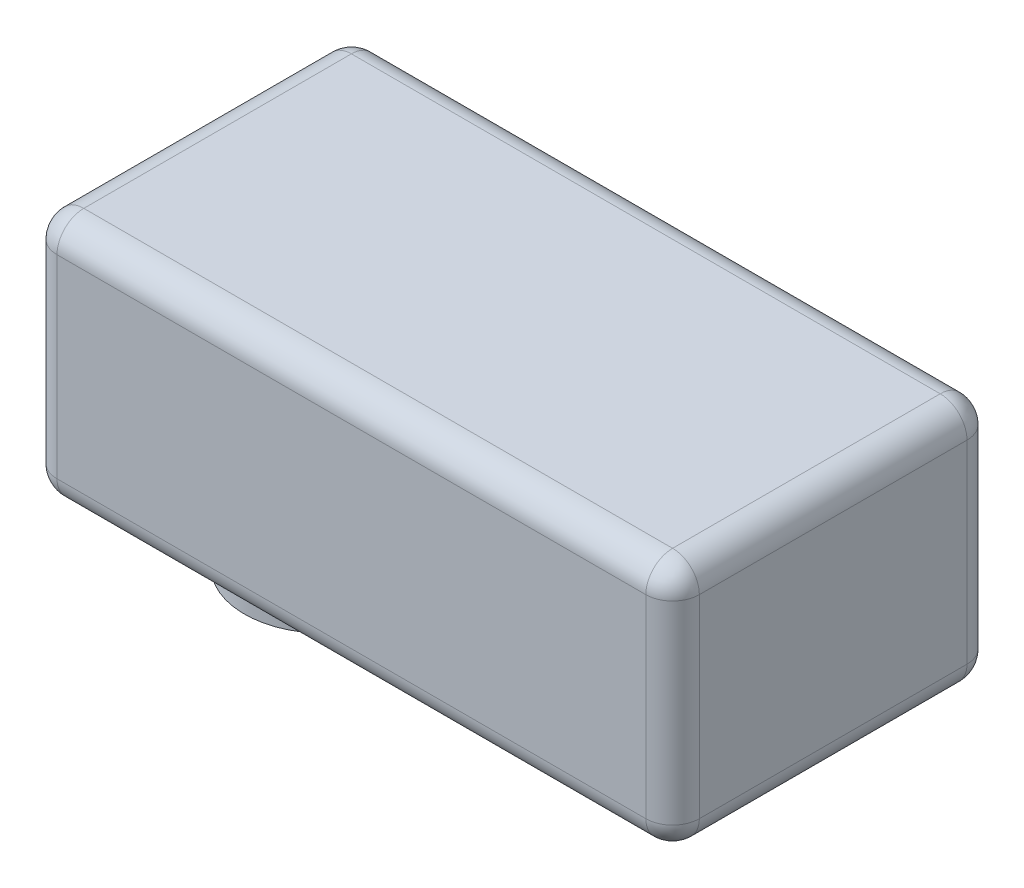
ISO-10303-21;
HEADER;
FILE_DESCRIPTION(('STEP AP214'),'2;1');
FILE_NAME('part.step','',(''),(''),'','','');
FILE_SCHEMA(('AUTOMOTIVE_DESIGN { 1 0 10303 214 1 1 1 1 }'));
ENDSEC;
DATA;
#1=APPLICATION_CONTEXT('core data for automotive mechanical design processes');
#2=APPLICATION_PROTOCOL_DEFINITION('international standard','automotive_design',2000,#1);
#3=PRODUCT_CONTEXT('',#1,'mechanical');
#4=PRODUCT('Part','Part','',(#3));
#5=PRODUCT_RELATED_PRODUCT_CATEGORY('part','',(#4));
#6=PRODUCT_DEFINITION_FORMATION('','',#4);
#7=PRODUCT_DEFINITION_CONTEXT('part definition',#1,'design');
#8=PRODUCT_DEFINITION('design','',#6,#7);
#9=PRODUCT_DEFINITION_SHAPE('','',#8);
#10=(LENGTH_UNIT() NAMED_UNIT(*) SI_UNIT(.MILLI.,.METRE.));
#11=(NAMED_UNIT(*) PLANE_ANGLE_UNIT() SI_UNIT($,.RADIAN.));
#12=(NAMED_UNIT(*) SI_UNIT($,.STERADIAN.) SOLID_ANGLE_UNIT());
#13=UNCERTAINTY_MEASURE_WITH_UNIT(LENGTH_MEASURE(1.E-05),#10,'distance_accuracy_value','');
#14=(GEOMETRIC_REPRESENTATION_CONTEXT(3) GLOBAL_UNCERTAINTY_ASSIGNED_CONTEXT((#13)) GLOBAL_UNIT_ASSIGNED_CONTEXT((#10,
#11,#12)) REPRESENTATION_CONTEXT('',''));
#15=CARTESIAN_POINT('',(0.,0.,0.));
#16=DIRECTION('',(0.,0.,1.));
#17=DIRECTION('',(1.,0.,0.));
#18=AXIS2_PLACEMENT_3D('',#15,#16,#17);
#19=CARTESIAN_POINT('',(22.,13.25,55.));
#20=DIRECTION('',(0.,-1.,0.));
#21=DIRECTION('',(1.,0.,0.));
#22=AXIS2_PLACEMENT_3D('',#19,#20,#21);
#23=SPHERICAL_SURFACE('',#22,2.);
#24=CARTESIAN_POINT('',(22.,13.25,55.));
#25=DIRECTION('',(0.,0.,-1.));
#26=DIRECTION('',(1.,0.,0.));
#27=AXIS2_PLACEMENT_3D('',#24,#25,#26);
#28=CIRCLE('',#27,2.);
#29=CARTESIAN_POINT('',(22.,15.25,55.));
#30=VERTEX_POINT('',#29);
#31=CARTESIAN_POINT('',(24.,13.25,55.));
#32=VERTEX_POINT('',#31);
#33=EDGE_CURVE('P0_E11',#30,#32,#28,.T.);
#34=ORIENTED_EDGE('',*,*,#33,.F.);
#35=CARTESIAN_POINT('',(22.,13.25,55.));
#36=DIRECTION('',(1.,0.,0.));
#37=DIRECTION('',(0.,0.,1.));
#38=AXIS2_PLACEMENT_3D('',#35,#36,#37);
#39=CIRCLE('',#38,2.);
#40=CARTESIAN_POINT('',(22.,13.25,57.));
#41=VERTEX_POINT('',#40);
#42=EDGE_CURVE('P0_E126',#30,#41,#39,.T.);
#43=ORIENTED_EDGE('',*,*,#42,.T.);
#44=CARTESIAN_POINT('',(22.,13.25,55.));
#45=DIRECTION('',(0.,-1.,0.));
#46=DIRECTION('',(1.,0.,0.));
#47=AXIS2_PLACEMENT_3D('',#44,#45,#46);
#48=CIRCLE('',#47,2.);
#49=EDGE_CURVE('P0_E173',#32,#41,#48,.T.);
#50=ORIENTED_EDGE('',*,*,#49,.F.);
#51=EDGE_LOOP('',(#34,#43,#50));
#52=FACE_BOUND('',#51,.T.);
#53=ADVANCED_FACE('P0_F17',(#52),#23,.T.);
#54=CARTESIAN_POINT('',(22.,13.25,35.));
#55=DIRECTION('',(0.,0.,1.));
#56=DIRECTION('',(1.,0.,0.));
#57=AXIS2_PLACEMENT_3D('',#54,#55,#56);
#58=SPHERICAL_SURFACE('',#57,2.);
#59=CARTESIAN_POINT('',(22.,13.25,35.));
#60=DIRECTION('',(0.,-1.,0.));
#61=DIRECTION('',(1.,0.,0.));
#62=AXIS2_PLACEMENT_3D('',#59,#60,#61);
#63=CIRCLE('',#62,2.);
#64=CARTESIAN_POINT('',(22.,13.25,33.));
#65=VERTEX_POINT('',#64);
#66=CARTESIAN_POINT('',(24.,13.25,35.));
#67=VERTEX_POINT('',#66);
#68=EDGE_CURVE('P0_E122',#65,#67,#63,.T.);
#69=ORIENTED_EDGE('',*,*,#68,.F.);
#70=CARTESIAN_POINT('',(22.,13.25,35.));
#71=DIRECTION('',(1.,0.,0.));
#72=DIRECTION('',(0.,1.,0.));
#73=AXIS2_PLACEMENT_3D('',#70,#71,#72);
#74=CIRCLE('',#73,2.);
#75=CARTESIAN_POINT('',(22.,15.25,35.));
#76=VERTEX_POINT('',#75);
#77=EDGE_CURVE('P0_E137',#65,#76,#74,.T.);
#78=ORIENTED_EDGE('',*,*,#77,.T.);
#79=CARTESIAN_POINT('',(22.,13.25,35.));
#80=DIRECTION('',(0.,0.,1.));
#81=DIRECTION('',(1.,0.,0.));
#82=AXIS2_PLACEMENT_3D('',#79,#80,#81);
#83=CIRCLE('',#82,2.);
#84=EDGE_CURVE('P0_E27',#67,#76,#83,.T.);
#85=ORIENTED_EDGE('',*,*,#84,.F.);
#86=EDGE_LOOP('',(#69,#78,#85));
#87=FACE_BOUND('',#86,.T.);
#88=ADVANCED_FACE('P0_F19',(#87),#58,.T.);
#89=CARTESIAN_POINT('',(24.,-3.25,33.));
#90=DIRECTION('',(1.,0.,0.));
#91=DIRECTION('',(0.,1.,0.));
#92=AXIS2_PLACEMENT_3D('',#89,#90,#91);
#93=PLANE('',#92);
#94=DIRECTION('',(0.,0.,1.));
#95=VECTOR('',#94,1.);
#96=CARTESIAN_POINT('',(24.,-1.25,33.));
#97=LINE('',#96,#95);
#98=CARTESIAN_POINT('',(24.,-1.25,35.));
#99=VERTEX_POINT('',#98);
#100=CARTESIAN_POINT('',(24.,-1.25,55.));
#101=VERTEX_POINT('',#100);
#102=EDGE_CURVE('P0_E141',#99,#101,#97,.T.);
#103=ORIENTED_EDGE('',*,*,#102,.F.);
#104=DIRECTION('',(0.,1.,0.));
#105=VECTOR('',#104,1.);
#106=CARTESIAN_POINT('',(24.,-3.25,35.));
#107=LINE('',#106,#105);
#108=EDGE_CURVE('P0_E116',#99,#67,#107,.T.);
#109=ORIENTED_EDGE('',*,*,#108,.T.);
#110=DIRECTION('',(0.,0.,1.));
#111=VECTOR('',#110,1.);
#112=CARTESIAN_POINT('',(24.,13.25,33.));
#113=LINE('',#112,#111);
#114=EDGE_CURVE('P0_E177',#67,#32,#113,.T.);
#115=ORIENTED_EDGE('',*,*,#114,.T.);
#116=DIRECTION('',(0.,1.,0.));
#117=VECTOR('',#116,1.);
#118=CARTESIAN_POINT('',(24.,-3.25,55.));
#119=LINE('',#118,#117);
#120=EDGE_CURVE('P0_E144',#101,#32,#119,.T.);
#121=ORIENTED_EDGE('',*,*,#120,.F.);
#122=EDGE_LOOP('',(#103,#109,#115,#121));
#123=FACE_BOUND('',#122,.T.);
#124=ADVANCED_FACE('P0_F142',(#123),#93,.T.);
#125=CARTESIAN_POINT('',(22.,-1.25,55.));
#126=DIRECTION('',(0.,0.,-1.));
#127=DIRECTION('',(1.,0.,0.));
#128=AXIS2_PLACEMENT_3D('',#125,#126,#127);
#129=SPHERICAL_SURFACE('',#128,2.);
#130=CARTESIAN_POINT('',(22.,-1.25,55.));
#131=DIRECTION('',(0.,1.,0.));
#132=DIRECTION('',(1.,0.,0.));
#133=AXIS2_PLACEMENT_3D('',#130,#131,#132);
#134=CIRCLE('',#133,2.);
#135=CARTESIAN_POINT('',(22.,-1.25,57.));
#136=VERTEX_POINT('',#135);
#137=EDGE_CURVE('P0_E174',#136,#101,#134,.T.);
#138=ORIENTED_EDGE('',*,*,#137,.F.);
#139=CARTESIAN_POINT('',(22.,-1.25,55.));
#140=DIRECTION('',(1.,0.,0.));
#141=DIRECTION('',(0.,-1.,0.));
#142=AXIS2_PLACEMENT_3D('',#139,#140,#141);
#143=CIRCLE('',#142,2.);
#144=CARTESIAN_POINT('',(22.,-3.25,55.));
#145=VERTEX_POINT('',#144);
#146=EDGE_CURVE('P0_E161',#136,#145,#143,.T.);
#147=ORIENTED_EDGE('',*,*,#146,.T.);
#148=CARTESIAN_POINT('',(22.,-1.25,55.));
#149=DIRECTION('',(0.,0.,-1.));
#150=DIRECTION('',(1.,0.,0.));
#151=AXIS2_PLACEMENT_3D('',#148,#149,#150);
#152=CIRCLE('',#151,2.);
#153=EDGE_CURVE('P0_E155',#101,#145,#152,.T.);
#154=ORIENTED_EDGE('',*,*,#153,.F.);
#155=EDGE_LOOP('',(#138,#147,#154));
#156=FACE_BOUND('',#155,.T.);
#157=ADVANCED_FACE('P0_F225',(#156),#129,.T.);
#158=CARTESIAN_POINT('',(22.,-1.25,35.));
#159=DIRECTION('',(0.,0.,1.));
#160=DIRECTION('',(1.,0.,0.));
#161=AXIS2_PLACEMENT_3D('',#158,#159,#160);
#162=SPHERICAL_SURFACE('',#161,2.);
#163=CARTESIAN_POINT('',(22.,-1.25,35.));
#164=DIRECTION('',(0.,0.,-1.));
#165=DIRECTION('',(1.,0.,0.));
#166=AXIS2_PLACEMENT_3D('',#163,#164,#165);
#167=CIRCLE('',#166,2.);
#168=CARTESIAN_POINT('',(22.,-3.25,35.));
#169=VERTEX_POINT('',#168);
#170=EDGE_CURVE('P0_E132',#99,#169,#167,.T.);
#171=ORIENTED_EDGE('',*,*,#170,.T.);
#172=CARTESIAN_POINT('',(22.,-1.25,35.));
#173=DIRECTION('',(-1.,0.,0.));
#174=DIRECTION('',(0.,-1.,0.));
#175=AXIS2_PLACEMENT_3D('',#172,#173,#174);
#176=CIRCLE('',#175,2.);
#177=CARTESIAN_POINT('',(22.,-1.25,33.));
#178=VERTEX_POINT('',#177);
#179=EDGE_CURVE('P0_E134',#178,#169,#176,.T.);
#180=ORIENTED_EDGE('',*,*,#179,.F.);
#181=CARTESIAN_POINT('',(22.,-1.25,35.));
#182=DIRECTION('',(0.,-1.,0.));
#183=DIRECTION('',(1.,0.,0.));
#184=AXIS2_PLACEMENT_3D('',#181,#182,#183);
#185=CIRCLE('',#184,2.);
#186=EDGE_CURVE('P0_E120',#178,#99,#185,.T.);
#187=ORIENTED_EDGE('',*,*,#186,.T.);
#188=EDGE_LOOP('',(#171,#180,#187));
#189=FACE_BOUND('',#188,.T.);
#190=ADVANCED_FACE('P0_F130',(#189),#162,.T.);
#191=CARTESIAN_POINT('',(22.,13.25,33.));
#192=DIRECTION('',(0.,0.,1.));
#193=DIRECTION('',(1.,0.,0.));
#194=AXIS2_PLACEMENT_3D('',#191,#192,#193);
#195=CYLINDRICAL_SURFACE('',#194,2.);
#196=ORIENTED_EDGE('',*,*,#114,.F.);
#197=ORIENTED_EDGE('',*,*,#84,.T.);
#198=DIRECTION('',(0.,0.,1.));
#199=VECTOR('',#198,1.);
#200=CARTESIAN_POINT('',(22.,15.25,33.));
#201=LINE('',#200,#199);
#202=EDGE_CURVE('P0_E185',#76,#30,#201,.T.);
#203=ORIENTED_EDGE('',*,*,#202,.T.);
#204=ORIENTED_EDGE('',*,*,#33,.T.);
#205=EDGE_LOOP('',(#196,#197,#203,#204));
#206=FACE_BOUND('',#205,.T.);
#207=ADVANCED_FACE('P0_F183',(#206),#195,.T.);
#208=CARTESIAN_POINT('',(22.,-3.25,55.));
#209=DIRECTION('',(0.,1.,0.));
#210=DIRECTION('',(1.,0.,0.));
#211=AXIS2_PLACEMENT_3D('',#208,#209,#210);
#212=CYLINDRICAL_SURFACE('',#211,2.);
#213=ORIENTED_EDGE('',*,*,#120,.T.);
#214=ORIENTED_EDGE('',*,*,#49,.T.);
#215=DIRECTION('',(0.,1.,0.));
#216=VECTOR('',#215,1.);
#217=CARTESIAN_POINT('',(22.,-3.25,57.));
#218=LINE('',#217,#216);
#219=EDGE_CURVE('P0_E262',#136,#41,#218,.T.);
#220=ORIENTED_EDGE('',*,*,#219,.F.);
#221=ORIENTED_EDGE('',*,*,#137,.T.);
#222=EDGE_LOOP('',(#213,#214,#220,#221));
#223=FACE_BOUND('',#222,.T.);
#224=ADVANCED_FACE('P0_F620',(#223),#212,.T.);
#225=CARTESIAN_POINT('',(-24.,13.25,55.));
#226=DIRECTION('',(1.,0.,0.));
#227=DIRECTION('',(0.,1.,0.));
#228=AXIS2_PLACEMENT_3D('',#225,#226,#227);
#229=CYLINDRICAL_SURFACE('',#228,2.);
#230=CARTESIAN_POINT('',(-22.,13.25,55.));
#231=DIRECTION('',(1.,0.,0.));
#232=DIRECTION('',(0.,0.,1.));
#233=AXIS2_PLACEMENT_3D('',#230,#231,#232);
#234=CIRCLE('',#233,2.);
#235=CARTESIAN_POINT('',(-22.,15.25,55.));
#236=VERTEX_POINT('',#235);
#237=CARTESIAN_POINT('',(-22.,13.25,57.));
#238=VERTEX_POINT('',#237);
#239=EDGE_CURVE('P0_E211',#236,#238,#234,.T.);
#240=ORIENTED_EDGE('',*,*,#239,.T.);
#241=DIRECTION('',(1.,0.,0.));
#242=VECTOR('',#241,1.);
#243=CARTESIAN_POINT('',(-24.,13.25,57.));
#244=LINE('',#243,#242);
#245=EDGE_CURVE('P0_E266',#238,#41,#244,.T.);
#246=ORIENTED_EDGE('',*,*,#245,.T.);
#247=ORIENTED_EDGE('',*,*,#42,.F.);
#248=DIRECTION('',(1.,0.,0.));
#249=VECTOR('',#248,1.);
#250=CARTESIAN_POINT('',(-24.,15.25,55.));
#251=LINE('',#250,#249);
#252=EDGE_CURVE('P0_E205',#236,#30,#251,.T.);
#253=ORIENTED_EDGE('',*,*,#252,.F.);
#254=EDGE_LOOP('',(#240,#246,#247,#253));
#255=FACE_BOUND('',#254,.T.);
#256=ADVANCED_FACE('P0_F275',(#255),#229,.T.);
#257=CARTESIAN_POINT('',(22.,-3.25,35.));
#258=DIRECTION('',(0.,1.,0.));
#259=DIRECTION('',(1.,0.,0.));
#260=AXIS2_PLACEMENT_3D('',#257,#258,#259);
#261=CYLINDRICAL_SURFACE('',#260,2.);
#262=ORIENTED_EDGE('',*,*,#186,.F.);
#263=DIRECTION('',(0.,1.,0.));
#264=VECTOR('',#263,1.);
#265=CARTESIAN_POINT('',(22.,-3.25,33.));
#266=LINE('',#265,#264);
#267=EDGE_CURVE('P0_E252',#178,#65,#266,.T.);
#268=ORIENTED_EDGE('',*,*,#267,.T.);
#269=ORIENTED_EDGE('',*,*,#68,.T.);
#270=ORIENTED_EDGE('',*,*,#108,.F.);
#271=EDGE_LOOP('',(#262,#268,#269,#270));
#272=FACE_BOUND('',#271,.T.);
#273=ADVANCED_FACE('P0_F118',(#272),#261,.T.);
#274=CARTESIAN_POINT('',(-24.,13.25,35.));
#275=DIRECTION('',(1.,0.,0.));
#276=DIRECTION('',(0.,1.,0.));
#277=AXIS2_PLACEMENT_3D('',#274,#275,#276);
#278=CYLINDRICAL_SURFACE('',#277,2.);
#279=DIRECTION('',(1.,0.,0.));
#280=VECTOR('',#279,1.);
#281=CARTESIAN_POINT('',(-24.,15.25,35.));
#282=LINE('',#281,#280);
#283=CARTESIAN_POINT('',(-22.,15.25,35.));
#284=VERTEX_POINT('',#283);
#285=EDGE_CURVE('P0_E195',#284,#76,#282,.T.);
#286=ORIENTED_EDGE('',*,*,#285,.T.);
#287=ORIENTED_EDGE('',*,*,#77,.F.);
#288=DIRECTION('',(1.,0.,0.));
#289=VECTOR('',#288,1.);
#290=CARTESIAN_POINT('',(-24.,13.25,33.));
#291=LINE('',#290,#289);
#292=CARTESIAN_POINT('',(-22.,13.25,33.));
#293=VERTEX_POINT('',#292);
#294=EDGE_CURVE('P0_E237',#293,#65,#291,.T.);
#295=ORIENTED_EDGE('',*,*,#294,.F.);
#296=CARTESIAN_POINT('',(-22.,13.25,35.));
#297=DIRECTION('',(1.,0.,0.));
#298=DIRECTION('',(0.,1.,0.));
#299=AXIS2_PLACEMENT_3D('',#296,#297,#298);
#300=CIRCLE('',#299,2.);
#301=EDGE_CURVE('P0_E197',#293,#284,#300,.T.);
#302=ORIENTED_EDGE('',*,*,#301,.T.);
#303=EDGE_LOOP('',(#286,#287,#295,#302));
#304=FACE_BOUND('',#303,.T.);
#305=ADVANCED_FACE('P0_F196',(#304),#278,.T.);
#306=CARTESIAN_POINT('',(22.,-1.25,33.));
#307=DIRECTION('',(0.,0.,1.));
#308=DIRECTION('',(1.,0.,0.));
#309=AXIS2_PLACEMENT_3D('',#306,#307,#308);
#310=CYLINDRICAL_SURFACE('',#309,2.);
#311=ORIENTED_EDGE('',*,*,#153,.T.);
#312=DIRECTION('',(0.,0.,1.));
#313=VECTOR('',#312,1.);
#314=CARTESIAN_POINT('',(22.,-3.25,33.));
#315=LINE('',#314,#313);
#316=EDGE_CURVE('P0_E152',#169,#145,#315,.T.);
#317=ORIENTED_EDGE('',*,*,#316,.F.);
#318=ORIENTED_EDGE('',*,*,#170,.F.);
#319=ORIENTED_EDGE('',*,*,#102,.T.);
#320=EDGE_LOOP('',(#311,#317,#318,#319));
#321=FACE_BOUND('',#320,.T.);
#322=ADVANCED_FACE('P0_F150',(#321),#310,.T.);
#323=CARTESIAN_POINT('',(-24.,-1.25,55.));
#324=DIRECTION('',(1.,0.,0.));
#325=DIRECTION('',(0.,-1.,0.));
#326=AXIS2_PLACEMENT_3D('',#323,#324,#325);
#327=CYLINDRICAL_SURFACE('',#326,2.);
#328=DIRECTION('',(1.,0.,0.));
#329=VECTOR('',#328,1.);
#330=CARTESIAN_POINT('',(-24.,-3.25,55.));
#331=LINE('',#330,#329);
#332=CARTESIAN_POINT('',(-22.,-3.25,55.));
#333=VERTEX_POINT('',#332);
#334=EDGE_CURVE('P0_E229',#333,#145,#331,.T.);
#335=ORIENTED_EDGE('',*,*,#334,.T.);
#336=ORIENTED_EDGE('',*,*,#146,.F.);
#337=DIRECTION('',(1.,0.,0.));
#338=VECTOR('',#337,1.);
#339=CARTESIAN_POINT('',(-24.,-1.25,57.));
#340=LINE('',#339,#338);
#341=CARTESIAN_POINT('',(-22.,-1.25,57.));
#342=VERTEX_POINT('',#341);
#343=EDGE_CURVE('P0_E257',#342,#136,#340,.T.);
#344=ORIENTED_EDGE('',*,*,#343,.F.);
#345=CARTESIAN_POINT('',(-22.,-1.25,55.));
#346=DIRECTION('',(1.,0.,0.));
#347=DIRECTION('',(0.,-1.,0.));
#348=AXIS2_PLACEMENT_3D('',#345,#346,#347);
#349=CIRCLE('',#348,2.);
#350=EDGE_CURVE('P0_E232',#342,#333,#349,.T.);
#351=ORIENTED_EDGE('',*,*,#350,.T.);
#352=EDGE_LOOP('',(#335,#336,#344,#351));
#353=FACE_BOUND('',#352,.T.);
#354=ADVANCED_FACE('P0_F230',(#353),#327,.T.);
#355=CARTESIAN_POINT('',(-24.,-1.25,35.));
#356=DIRECTION('',(1.,0.,0.));
#357=DIRECTION('',(0.,-1.,0.));
#358=AXIS2_PLACEMENT_3D('',#355,#356,#357);
#359=CYLINDRICAL_SURFACE('',#358,2.);
#360=CARTESIAN_POINT('',(-22.,-1.25,35.));
#361=DIRECTION('',(-1.,0.,0.));
#362=DIRECTION('',(0.,-1.,0.));
#363=AXIS2_PLACEMENT_3D('',#360,#361,#362);
#364=CIRCLE('',#363,2.);
#365=CARTESIAN_POINT('',(-22.,-1.25,33.));
#366=VERTEX_POINT('',#365);
#367=CARTESIAN_POINT('',(-22.,-3.25,35.));
#368=VERTEX_POINT('',#367);
#369=EDGE_CURVE('P0_E312',#366,#368,#364,.T.);
#370=ORIENTED_EDGE('',*,*,#369,.F.);
#371=DIRECTION('',(1.,0.,0.));
#372=VECTOR('',#371,1.);
#373=CARTESIAN_POINT('',(-24.,-1.25,33.));
#374=LINE('',#373,#372);
#375=EDGE_CURVE('P0_E255',#366,#178,#374,.T.);
#376=ORIENTED_EDGE('',*,*,#375,.T.);
#377=ORIENTED_EDGE('',*,*,#179,.T.);
#378=DIRECTION('',(1.,0.,0.));
#379=VECTOR('',#378,1.);
#380=CARTESIAN_POINT('',(-24.,-3.25,35.));
#381=LINE('',#380,#379);
#382=EDGE_CURVE('P0_E240',#368,#169,#381,.T.);
#383=ORIENTED_EDGE('',*,*,#382,.F.);
#384=EDGE_LOOP('',(#370,#376,#377,#383));
#385=FACE_BOUND('',#384,.T.);
#386=ADVANCED_FACE('P0_F520',(#385),#359,.T.);
#387=CARTESIAN_POINT('',(-24.,15.25,33.));
#388=DIRECTION('',(0.,1.,0.));
#389=DIRECTION('',(1.,0.,0.));
#390=AXIS2_PLACEMENT_3D('',#387,#388,#389);
#391=PLANE('',#390);
#392=DIRECTION('',(0.,0.,1.));
#393=VECTOR('',#392,1.);
#394=CARTESIAN_POINT('',(-22.,15.25,33.));
#395=LINE('',#394,#393);
#396=EDGE_CURVE('P0_E330',#284,#236,#395,.T.);
#397=ORIENTED_EDGE('',*,*,#396,.T.);
#398=ORIENTED_EDGE('',*,*,#252,.T.);
#399=ORIENTED_EDGE('',*,*,#202,.F.);
#400=ORIENTED_EDGE('',*,*,#285,.F.);
#401=EDGE_LOOP('',(#397,#398,#399,#400));
#402=FACE_BOUND('',#401,.T.);
#403=ADVANCED_FACE('P0_F203',(#402),#391,.T.);
#404=CARTESIAN_POINT('',(-22.,13.25,55.));
#405=DIRECTION('',(0.,-1.,0.));
#406=DIRECTION('',(-1.,0.,0.));
#407=AXIS2_PLACEMENT_3D('',#404,#405,#406);
#408=SPHERICAL_SURFACE('',#407,2.);
#409=CARTESIAN_POINT('',(-22.,13.25,55.));
#410=DIRECTION('',(0.,1.,0.));
#411=DIRECTION('',(-1.,0.,0.));
#412=AXIS2_PLACEMENT_3D('',#409,#410,#411);
#413=CIRCLE('',#412,2.);
#414=CARTESIAN_POINT('',(-24.,13.25,55.));
#415=VERTEX_POINT('',#414);
#416=EDGE_CURVE('P0_E287',#415,#238,#413,.T.);
#417=ORIENTED_EDGE('',*,*,#416,.T.);
#418=ORIENTED_EDGE('',*,*,#239,.F.);
#419=CARTESIAN_POINT('',(-22.,13.25,55.));
#420=DIRECTION('',(0.,0.,1.));
#421=DIRECTION('',(-1.,0.,0.));
#422=AXIS2_PLACEMENT_3D('',#419,#420,#421);
#423=CIRCLE('',#422,2.);
#424=EDGE_CURVE('P0_E290',#236,#415,#423,.T.);
#425=ORIENTED_EDGE('',*,*,#424,.T.);
#426=EDGE_LOOP('',(#417,#418,#425));
#427=FACE_BOUND('',#426,.T.);
#428=ADVANCED_FACE('P0_F288',(#427),#408,.T.);
#429=CARTESIAN_POINT('',(-24.,-3.25,57.));
#430=DIRECTION('',(0.,0.,1.));
#431=DIRECTION('',(1.,0.,0.));
#432=AXIS2_PLACEMENT_3D('',#429,#430,#431);
#433=PLANE('',#432);
#434=DIRECTION('',(0.,1.,0.));
#435=VECTOR('',#434,1.);
#436=CARTESIAN_POINT('',(-22.,-3.25,57.));
#437=LINE('',#436,#435);
#438=EDGE_CURVE('P0_E284',#342,#238,#437,.T.);
#439=ORIENTED_EDGE('',*,*,#438,.F.);
#440=ORIENTED_EDGE('',*,*,#343,.T.);
#441=ORIENTED_EDGE('',*,*,#219,.T.);
#442=ORIENTED_EDGE('',*,*,#245,.F.);
#443=EDGE_LOOP('',(#439,#440,#441,#442));
#444=FACE_BOUND('',#443,.T.);
#445=ADVANCED_FACE('P0_F282',(#444),#433,.T.);
#446=CARTESIAN_POINT('',(-22.,13.25,35.));
#447=DIRECTION('',(0.,0.,1.));
#448=DIRECTION('',(-1.,0.,0.));
#449=AXIS2_PLACEMENT_3D('',#446,#447,#448);
#450=SPHERICAL_SURFACE('',#449,2.);
#451=CARTESIAN_POINT('',(-22.,13.25,35.));
#452=DIRECTION('',(0.,0.,-1.));
#453=DIRECTION('',(-1.,0.,0.));
#454=AXIS2_PLACEMENT_3D('',#451,#452,#453);
#455=CIRCLE('',#454,2.);
#456=CARTESIAN_POINT('',(-24.,13.25,35.));
#457=VERTEX_POINT('',#456);
#458=EDGE_CURVE('P0_E308',#457,#284,#455,.T.);
#459=ORIENTED_EDGE('',*,*,#458,.T.);
#460=ORIENTED_EDGE('',*,*,#301,.F.);
#461=CARTESIAN_POINT('',(-22.,13.25,35.));
#462=DIRECTION('',(0.,1.,0.));
#463=DIRECTION('',(-1.,0.,0.));
#464=AXIS2_PLACEMENT_3D('',#461,#462,#463);
#465=CIRCLE('',#464,2.);
#466=EDGE_CURVE('P0_E360',#293,#457,#465,.T.);
#467=ORIENTED_EDGE('',*,*,#466,.T.);
#468=EDGE_LOOP('',(#459,#460,#467));
#469=FACE_BOUND('',#468,.T.);
#470=ADVANCED_FACE('P0_F475',(#469),#450,.T.);
#471=CARTESIAN_POINT('',(-24.,-3.25,33.));
#472=DIRECTION('',(0.,0.,1.));
#473=DIRECTION('',(1.,0.,0.));
#474=AXIS2_PLACEMENT_3D('',#471,#472,#473);
#475=PLANE('',#474);
#476=ORIENTED_EDGE('',*,*,#294,.T.);
#477=ORIENTED_EDGE('',*,*,#267,.F.);
#478=ORIENTED_EDGE('',*,*,#375,.F.);
#479=DIRECTION('',(0.,1.,0.));
#480=VECTOR('',#479,1.);
#481=CARTESIAN_POINT('',(-22.,-3.25,33.));
#482=LINE('',#481,#480);
#483=EDGE_CURVE('P0_E367',#366,#293,#482,.T.);
#484=ORIENTED_EDGE('',*,*,#483,.T.);
#485=EDGE_LOOP('',(#476,#477,#478,#484));
#486=FACE_BOUND('',#485,.T.);
#487=ADVANCED_FACE('P0_F601',(#486),#475,.F.);
#488=CARTESIAN_POINT('',(-24.,-3.25,33.));
#489=DIRECTION('',(0.,1.,0.));
#490=DIRECTION('',(1.,0.,0.));
#491=AXIS2_PLACEMENT_3D('',#488,#489,#490);
#492=PLANE('',#491);
#493=ORIENTED_EDGE('',*,*,#382,.T.);
#494=ORIENTED_EDGE('',*,*,#316,.T.);
#495=ORIENTED_EDGE('',*,*,#334,.F.);
#496=DIRECTION('',(0.,0.,1.));
#497=VECTOR('',#496,1.);
#498=CARTESIAN_POINT('',(-22.,-3.25,33.));
#499=LINE('',#498,#497);
#500=EDGE_CURVE('P0_E352',#368,#333,#499,.T.);
#501=ORIENTED_EDGE('',*,*,#500,.F.);
#502=EDGE_LOOP('',(#493,#494,#495,#501));
#503=FACE_BOUND('',#502,.T.);
#504=ADVANCED_FACE('P0_F239',(#503),#492,.F.);
#505=CARTESIAN_POINT('',(-22.,-1.25,55.));
#506=DIRECTION('',(0.,0.,-1.));
#507=DIRECTION('',(-1.,0.,0.));
#508=AXIS2_PLACEMENT_3D('',#505,#506,#507);
#509=SPHERICAL_SURFACE('',#508,2.);
#510=CARTESIAN_POINT('',(-22.,-1.25,55.));
#511=DIRECTION('',(0.,0.,1.));
#512=DIRECTION('',(-1.,0.,0.));
#513=AXIS2_PLACEMENT_3D('',#510,#511,#512);
#514=CIRCLE('',#513,2.);
#515=CARTESIAN_POINT('',(-24.,-1.25,55.));
#516=VERTEX_POINT('',#515);
#517=EDGE_CURVE('P0_E356',#516,#333,#514,.T.);
#518=ORIENTED_EDGE('',*,*,#517,.T.);
#519=ORIENTED_EDGE('',*,*,#350,.F.);
#520=CARTESIAN_POINT('',(-22.,-1.25,55.));
#521=DIRECTION('',(0.,-1.,0.));
#522=DIRECTION('',(-1.,0.,0.));
#523=AXIS2_PLACEMENT_3D('',#520,#521,#522);
#524=CIRCLE('',#523,2.);
#525=EDGE_CURVE('P0_E298',#342,#516,#524,.T.);
#526=ORIENTED_EDGE('',*,*,#525,.T.);
#527=EDGE_LOOP('',(#518,#519,#526));
#528=FACE_BOUND('',#527,.T.);
#529=ADVANCED_FACE('P0_F555',(#528),#509,.T.);
#530=CARTESIAN_POINT('',(-22.,-1.25,35.));
#531=DIRECTION('',(0.,0.,1.));
#532=DIRECTION('',(-1.,0.,0.));
#533=AXIS2_PLACEMENT_3D('',#530,#531,#532);
#534=SPHERICAL_SURFACE('',#533,2.);
#535=CARTESIAN_POINT('',(-22.,-1.25,35.));
#536=DIRECTION('',(0.,1.,0.));
#537=DIRECTION('',(-1.,0.,0.));
#538=AXIS2_PLACEMENT_3D('',#535,#536,#537);
#539=CIRCLE('',#538,2.);
#540=CARTESIAN_POINT('',(-24.,-1.25,35.));
#541=VERTEX_POINT('',#540);
#542=EDGE_CURVE('P0_E304',#366,#541,#539,.T.);
#543=ORIENTED_EDGE('',*,*,#542,.F.);
#544=ORIENTED_EDGE('',*,*,#369,.T.);
#545=CARTESIAN_POINT('',(-22.,-1.25,35.));
#546=DIRECTION('',(0.,0.,1.));
#547=DIRECTION('',(-1.,0.,0.));
#548=AXIS2_PLACEMENT_3D('',#545,#546,#547);
#549=CIRCLE('',#548,2.);
#550=EDGE_CURVE('P0_E384',#541,#368,#549,.T.);
#551=ORIENTED_EDGE('',*,*,#550,.F.);
#552=EDGE_LOOP('',(#543,#544,#551));
#553=FACE_BOUND('',#552,.T.);
#554=ADVANCED_FACE('P0_F560',(#553),#534,.T.);
#555=CARTESIAN_POINT('',(-22.,13.25,33.));
#556=DIRECTION('',(0.,0.,1.));
#557=DIRECTION('',(-1.,0.,0.));
#558=AXIS2_PLACEMENT_3D('',#555,#556,#557);
#559=CYLINDRICAL_SURFACE('',#558,2.);
#560=ORIENTED_EDGE('',*,*,#424,.F.);
#561=ORIENTED_EDGE('',*,*,#396,.F.);
#562=ORIENTED_EDGE('',*,*,#458,.F.);
#563=DIRECTION('',(0.,0.,1.));
#564=VECTOR('',#563,1.);
#565=CARTESIAN_POINT('',(-24.,13.25,33.));
#566=LINE('',#565,#564);
#567=EDGE_CURVE('P0_E406',#457,#415,#566,.T.);
#568=ORIENTED_EDGE('',*,*,#567,.T.);
#569=EDGE_LOOP('',(#560,#561,#562,#568));
#570=FACE_BOUND('',#569,.T.);
#571=ADVANCED_FACE('P0_F540',(#570),#559,.T.);
#572=CARTESIAN_POINT('',(-22.,-3.25,55.));
#573=DIRECTION('',(0.,1.,0.));
#574=DIRECTION('',(-1.,0.,0.));
#575=AXIS2_PLACEMENT_3D('',#572,#573,#574);
#576=CYLINDRICAL_SURFACE('',#575,2.);
#577=ORIENTED_EDGE('',*,*,#525,.F.);
#578=ORIENTED_EDGE('',*,*,#438,.T.);
#579=ORIENTED_EDGE('',*,*,#416,.F.);
#580=DIRECTION('',(0.,1.,0.));
#581=VECTOR('',#580,1.);
#582=CARTESIAN_POINT('',(-24.,-3.25,55.));
#583=LINE('',#582,#581);
#584=EDGE_CURVE('P0_E412',#516,#415,#583,.T.);
#585=ORIENTED_EDGE('',*,*,#584,.F.);
#586=EDGE_LOOP('',(#577,#578,#579,#585));
#587=FACE_BOUND('',#586,.T.);
#588=ADVANCED_FACE('P0_F296',(#587),#576,.T.);
#589=CARTESIAN_POINT('',(-22.,-3.25,35.));
#590=DIRECTION('',(0.,1.,0.));
#591=DIRECTION('',(-1.,0.,0.));
#592=AXIS2_PLACEMENT_3D('',#589,#590,#591);
#593=CYLINDRICAL_SURFACE('',#592,2.);
#594=DIRECTION('',(0.,1.,0.));
#595=VECTOR('',#594,1.);
#596=CARTESIAN_POINT('',(-24.,-3.25,35.));
#597=LINE('',#596,#595);
#598=EDGE_CURVE('P0_E396',#541,#457,#597,.T.);
#599=ORIENTED_EDGE('',*,*,#598,.T.);
#600=ORIENTED_EDGE('',*,*,#466,.F.);
#601=ORIENTED_EDGE('',*,*,#483,.F.);
#602=ORIENTED_EDGE('',*,*,#542,.T.);
#603=EDGE_LOOP('',(#599,#600,#601,#602));
#604=FACE_BOUND('',#603,.T.);
#605=ADVANCED_FACE('P0_F486',(#604),#593,.T.);
#606=CARTESIAN_POINT('',(-22.,-1.25,33.));
#607=DIRECTION('',(0.,0.,1.));
#608=DIRECTION('',(-1.,0.,0.));
#609=AXIS2_PLACEMENT_3D('',#606,#607,#608);
#610=CYLINDRICAL_SURFACE('',#609,2.);
#611=DIRECTION('',(0.,0.,1.));
#612=VECTOR('',#611,1.);
#613=CARTESIAN_POINT('',(-24.,-1.25,33.));
#614=LINE('',#613,#612);
#615=EDGE_CURVE('P0_E389',#541,#516,#614,.T.);
#616=ORIENTED_EDGE('',*,*,#615,.F.);
#617=ORIENTED_EDGE('',*,*,#550,.T.);
#618=ORIENTED_EDGE('',*,*,#500,.T.);
#619=ORIENTED_EDGE('',*,*,#517,.F.);
#620=EDGE_LOOP('',(#616,#617,#618,#619));
#621=FACE_BOUND('',#620,.T.);
#622=ADVANCED_FACE('P0_F462',(#621),#610,.T.);
#623=CARTESIAN_POINT('',(-24.,-3.25,33.));
#624=DIRECTION('',(1.,0.,0.));
#625=DIRECTION('',(0.,1.,0.));
#626=AXIS2_PLACEMENT_3D('',#623,#624,#625);
#627=PLANE('',#626);
#628=ORIENTED_EDGE('',*,*,#584,.T.);
#629=ORIENTED_EDGE('',*,*,#567,.F.);
#630=ORIENTED_EDGE('',*,*,#598,.F.);
#631=ORIENTED_EDGE('',*,*,#615,.T.);
#632=EDGE_LOOP('',(#628,#629,#630,#631));
#633=FACE_BOUND('',#632,.T.);
#634=ADVANCED_FACE('P0_F456',(#633),#627,.F.);
#635=CLOSED_SHELL('',(#53,#88,#124,#157,#190,#207,#224,#256,#273,#305,#322,#354,#386,#403,#428,
#445,#470,#487,#504,#529,#554,#571,#588,#605,#622,#634));
#636=MANIFOLD_SOLID_BREP('P0_B1',#635);
#637=CARTESIAN_POINT('',(-14.,-6.0102724962,45.));
#638=DIRECTION('',(0.,-1.,0.));
#639=DIRECTION('',(0.,0.,-1.));
#640=AXIS2_PLACEMENT_3D('',#637,#638,#639);
#641=PLANE('',#640);
#642=CARTESIAN_POINT('',(-14.,-6.0102724962,45.));
#643=DIRECTION('',(0.,-1.,0.));
#644=DIRECTION('',(1.,0.,0.));
#645=AXIS2_PLACEMENT_3D('',#642,#643,#644);
#646=CIRCLE('',#645,6.);
#647=CARTESIAN_POINT('',(-8.,-6.0102724962,45.));
#648=VERTEX_POINT('',#647);
#649=EDGE_CURVE('P1_E9',#648,#648,#646,.T.);
#650=ORIENTED_EDGE('',*,*,#649,.F.);
#651=EDGE_LOOP('',(#650));
#652=FACE_BOUND('',#651,.T.);
#653=ADVANCED_FACE('P1_F14',(#652),#641,.F.);
#654=CARTESIAN_POINT('',(-14.,-9.0102724962,45.));
#655=DIRECTION('',(0.,-1.,0.));
#656=DIRECTION('',(0.,0.,-1.));
#657=AXIS2_PLACEMENT_3D('',#654,#655,#656);
#658=PLANE('',#657);
#659=CARTESIAN_POINT('',(-14.,-9.0102724962,45.));
#660=DIRECTION('',(0.,-1.,0.));
#661=DIRECTION('',(1.,0.,0.));
#662=AXIS2_PLACEMENT_3D('',#659,#660,#661);
#663=CIRCLE('',#662,6.);
#664=CARTESIAN_POINT('',(-8.,-9.0102724962,45.));
#665=VERTEX_POINT('',#664);
#666=EDGE_CURVE('P1_E21',#665,#665,#663,.T.);
#667=ORIENTED_EDGE('',*,*,#666,.T.);
#668=EDGE_LOOP('',(#667));
#669=FACE_BOUND('',#668,.T.);
#670=ADVANCED_FACE('P1_F34',(#669),#658,.T.);
#671=CARTESIAN_POINT('',(-14.,-6.0102724962,45.));
#672=DIRECTION('',(0.,-1.,0.));
#673=DIRECTION('',(1.,0.,0.));
#674=AXIS2_PLACEMENT_3D('',#671,#672,#673);
#675=CYLINDRICAL_SURFACE('',#674,6.);
#676=ORIENTED_EDGE('',*,*,#666,.F.);
#677=EDGE_LOOP('',(#676));
#678=FACE_BOUND('',#677,.T.);
#679=ORIENTED_EDGE('',*,*,#649,.T.);
#680=EDGE_LOOP('',(#679));
#681=FACE_BOUND('',#680,.T.);
#682=ADVANCED_FACE('P1_F36',(#678,#681),#675,.T.);
#683=CLOSED_SHELL('',(#653,#670,#682));
#684=MANIFOLD_SOLID_BREP('P1_B1',#683);
#685=ADVANCED_BREP_SHAPE_REPRESENTATION('',(#18,#636,#684),#14);
#686=SHAPE_DEFINITION_REPRESENTATION(#9,#685);
ENDSEC;
END-ISO-10303-21;
